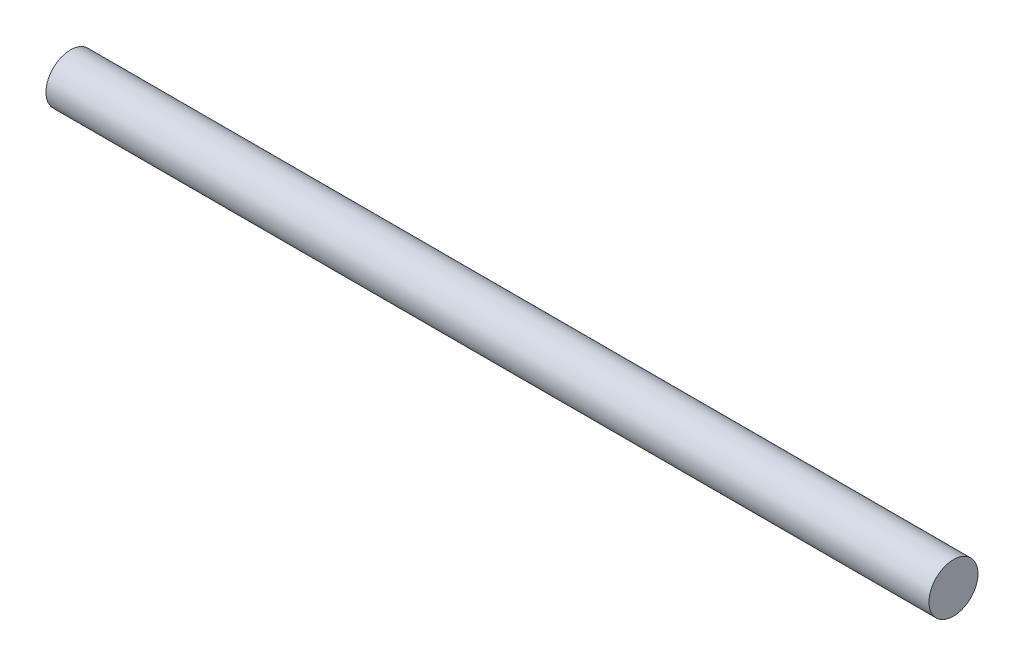
ISO-10303-21;
HEADER;
FILE_DESCRIPTION(('STEP AP214'),'2;1');
FILE_NAME('part.step','',(''),(''),'','','');
FILE_SCHEMA(('AUTOMOTIVE_DESIGN { 1 0 10303 214 1 1 1 1 }'));
ENDSEC;
DATA;
#1=APPLICATION_CONTEXT('core data for automotive mechanical design processes');
#2=APPLICATION_PROTOCOL_DEFINITION('international standard','automotive_design',2000,#1);
#3=PRODUCT_CONTEXT('',#1,'mechanical');
#4=PRODUCT('Part','Part','',(#3));
#5=PRODUCT_RELATED_PRODUCT_CATEGORY('part','',(#4));
#6=PRODUCT_DEFINITION_FORMATION('','',#4);
#7=PRODUCT_DEFINITION_CONTEXT('part definition',#1,'design');
#8=PRODUCT_DEFINITION('design','',#6,#7);
#9=PRODUCT_DEFINITION_SHAPE('','',#8);
#10=(LENGTH_UNIT() NAMED_UNIT(*) SI_UNIT(.MILLI.,.METRE.));
#11=(NAMED_UNIT(*) PLANE_ANGLE_UNIT() SI_UNIT($,.RADIAN.));
#12=(NAMED_UNIT(*) SI_UNIT($,.STERADIAN.) SOLID_ANGLE_UNIT());
#13=UNCERTAINTY_MEASURE_WITH_UNIT(LENGTH_MEASURE(1.E-05),#10,'distance_accuracy_value','');
#14=(GEOMETRIC_REPRESENTATION_CONTEXT(3) GLOBAL_UNCERTAINTY_ASSIGNED_CONTEXT((#13)) GLOBAL_UNIT_ASSIGNED_CONTEXT((#10,
#11,#12)) REPRESENTATION_CONTEXT('',''));
#15=CARTESIAN_POINT('',(0.,0.,0.));
#16=DIRECTION('',(0.,0.,1.));
#17=DIRECTION('',(1.,0.,0.));
#18=AXIS2_PLACEMENT_3D('',#15,#16,#17);
#19=CARTESIAN_POINT('',(-90.,0.,0.));
#20=DIRECTION('',(1.,0.,0.));
#21=DIRECTION('',(0.,0.,-1.));
#22=AXIS2_PLACEMENT_3D('',#19,#20,#21);
#23=CYLINDRICAL_SURFACE('',#22,2.5);
#24=CARTESIAN_POINT('',(-90.,0.,0.));
#25=DIRECTION('',(1.,0.,0.));
#26=DIRECTION('',(0.,0.,-1.));
#27=AXIS2_PLACEMENT_3D('',#24,#25,#26);
#28=CIRCLE('',#27,2.5);
#29=CARTESIAN_POINT('',(-90.,0.,-2.5));
#30=VERTEX_POINT('',#29);
#31=EDGE_CURVE('E10',#30,#30,#28,.T.);
#32=CARTESIAN_POINT('',(0.,0.,0.));
#33=DIRECTION('',(1.,0.,0.));
#34=DIRECTION('',(0.,0.,-1.));
#35=AXIS2_PLACEMENT_3D('',#32,#33,#34);
#36=CIRCLE('',#35,2.5);
#37=CARTESIAN_POINT('',(0.,0.,-2.5));
#38=VERTEX_POINT('',#37);
#39=EDGE_CURVE('E34',#38,#38,#36,.T.);
#40=CARTESIAN_POINT('',(-90.,0.,-2.5));
#41=CARTESIAN_POINT('',(-89.0625,0.,-2.5));
#42=CARTESIAN_POINT('',(-88.125,0.,-2.5));
#43=CARTESIAN_POINT('',(-86.25,0.,-2.5));
#44=CARTESIAN_POINT('',(-85.3125,0.,-2.5));
#45=CARTESIAN_POINT('',(-83.4375,0.,-2.5));
#46=CARTESIAN_POINT('',(-82.5,0.,-2.5));
#47=CARTESIAN_POINT('',(-80.625,0.,-2.5));
#48=CARTESIAN_POINT('',(-79.6875,0.,-2.5));
#49=CARTESIAN_POINT('',(-77.8125,0.,-2.5));
#50=CARTESIAN_POINT('',(-76.875,0.,-2.5));
#51=CARTESIAN_POINT('',(-75.,0.,-2.5));
#52=CARTESIAN_POINT('',(-74.0625,0.,-2.5));
#53=CARTESIAN_POINT('',(-72.1875,0.,-2.5));
#54=CARTESIAN_POINT('',(-71.25,0.,-2.5));
#55=CARTESIAN_POINT('',(-69.375,0.,-2.5));
#56=CARTESIAN_POINT('',(-68.4375,0.,-2.5));
#57=CARTESIAN_POINT('',(-66.5625,0.,-2.5));
#58=CARTESIAN_POINT('',(-65.625,0.,-2.5));
#59=CARTESIAN_POINT('',(-63.75,0.,-2.5));
#60=CARTESIAN_POINT('',(-62.8125,0.,-2.5));
#61=CARTESIAN_POINT('',(-60.9375,0.,-2.5));
#62=CARTESIAN_POINT('',(-60.,0.,-2.5));
#63=CARTESIAN_POINT('',(-58.125,0.,-2.5));
#64=CARTESIAN_POINT('',(-57.1875,0.,-2.5));
#65=CARTESIAN_POINT('',(-55.3125,0.,-2.5));
#66=CARTESIAN_POINT('',(-54.375,0.,-2.5));
#67=CARTESIAN_POINT('',(-52.5,0.,-2.5));
#68=CARTESIAN_POINT('',(-51.5625,0.,-2.5));
#69=CARTESIAN_POINT('',(-49.6875,0.,-2.5));
#70=CARTESIAN_POINT('',(-48.75,0.,-2.5));
#71=CARTESIAN_POINT('',(-46.875,0.,-2.5));
#72=CARTESIAN_POINT('',(-45.9375,0.,-2.5));
#73=CARTESIAN_POINT('',(-44.0625,0.,-2.5));
#74=CARTESIAN_POINT('',(-43.125,0.,-2.5));
#75=CARTESIAN_POINT('',(-41.25,0.,-2.5));
#76=CARTESIAN_POINT('',(-40.3125,0.,-2.5));
#77=CARTESIAN_POINT('',(-38.4375,0.,-2.5));
#78=CARTESIAN_POINT('',(-37.5,0.,-2.5));
#79=CARTESIAN_POINT('',(-35.625,0.,-2.5));
#80=CARTESIAN_POINT('',(-34.6875,0.,-2.5));
#81=CARTESIAN_POINT('',(-32.8125,0.,-2.5));
#82=CARTESIAN_POINT('',(-31.875,0.,-2.5));
#83=CARTESIAN_POINT('',(-30.,0.,-2.5));
#84=CARTESIAN_POINT('',(-29.0625,0.,-2.5));
#85=CARTESIAN_POINT('',(-27.1875,0.,-2.5));
#86=CARTESIAN_POINT('',(-26.25,0.,-2.5));
#87=CARTESIAN_POINT('',(-24.375,0.,-2.5));
#88=CARTESIAN_POINT('',(-23.4375,0.,-2.5));
#89=CARTESIAN_POINT('',(-21.5625,0.,-2.5));
#90=CARTESIAN_POINT('',(-20.625,0.,-2.5));
#91=CARTESIAN_POINT('',(-18.75,0.,-2.5));
#92=CARTESIAN_POINT('',(-17.8125,0.,-2.5));
#93=CARTESIAN_POINT('',(-15.9375,0.,-2.5));
#94=CARTESIAN_POINT('',(-15.,0.,-2.5));
#95=CARTESIAN_POINT('',(-13.125,0.,-2.5));
#96=CARTESIAN_POINT('',(-12.1875,0.,-2.5));
#97=CARTESIAN_POINT('',(-10.3125,0.,-2.5));
#98=CARTESIAN_POINT('',(-9.37500000000001,0.,-2.5));
#99=CARTESIAN_POINT('',(-7.50000000000002,0.,-2.5));
#100=CARTESIAN_POINT('',(-6.56250000000002,0.,-2.5));
#101=CARTESIAN_POINT('',(-4.68750000000002,0.,-2.5));
#102=CARTESIAN_POINT('',(-3.75000000000001,0.,-2.5));
#103=CARTESIAN_POINT('',(-1.87500000000001,0.,-2.5));
#104=CARTESIAN_POINT('',(-0.937500000000014,0.,-2.5));
#105=CARTESIAN_POINT('',(0.,0.,-2.5));
#106=B_SPLINE_CURVE_WITH_KNOTS('',3,(#40,#41,#42,#43,#44,#45,#46,#47,#48,#49,#50,#51,#52,#53,
#54,#55,#56,#57,#58,#59,#60,#61,#62,#63,#64,#65,#66,#67,#68,#69,#70,#71,#72,#73,#74,#75,#76,#77,
#78,#79,#80,#81,#82,#83,#84,#85,#86,#87,#88,#89,#90,#91,#92,#93,#94,#95,#96,#97,#98,#99,#100,
#101,#102,#103,#104,#105),.UNSPECIFIED.,.F.,.F.,(4,2,2,2,2,2,2,2,2,2,2,2,2,2,2,2,2,2,2,2,2,2,2,
2,2,2,2,2,2,2,2,2,4),(0.,2.8125,5.62499999999999,8.43749999999999,11.25,14.0625,16.875,19.6875,
22.5,25.3125,28.125,30.9375,33.75,36.5625,39.375,42.1875,45.,47.8125,50.625,53.4375,56.25,
59.0625,61.875,64.6875,67.5,70.3125,73.125,75.9375,78.75,81.5625,84.375,87.1875,90.),.UNSPECIFIED.);
#107=EDGE_CURVE('BSEAM31',#30,#38,#106,.T.);
#108=ORIENTED_EDGE('',*,*,#31,.T.);
#109=ORIENTED_EDGE('',*,*,#39,.F.);
#110=ORIENTED_EDGE('',*,*,#107,.T.);
#111=ORIENTED_EDGE('',*,*,#107,.F.);
#112=EDGE_LOOP('',(#108,#110,#109,#111));
#113=FACE_BOUND('',#112,.T.);
#114=ADVANCED_FACE('F31',(#113),#23,.T.);
#115=CARTESIAN_POINT('',(-90.,0.,0.));
#116=DIRECTION('',(1.,0.,0.));
#117=DIRECTION('',(0.,0.,-1.));
#118=AXIS2_PLACEMENT_3D('',#115,#116,#117);
#119=PLANE('',#118);
#120=ORIENTED_EDGE('',*,*,#31,.F.);
#121=EDGE_LOOP('',(#120));
#122=FACE_BOUND('',#121,.T.);
#123=ADVANCED_FACE('F46',(#122),#119,.F.);
#124=CARTESIAN_POINT('',(0.,0.,0.));
#125=DIRECTION('',(1.,0.,0.));
#126=DIRECTION('',(0.,0.,-1.));
#127=AXIS2_PLACEMENT_3D('',#124,#125,#126);
#128=PLANE('',#127);
#129=ORIENTED_EDGE('',*,*,#39,.T.);
#130=EDGE_LOOP('',(#129));
#131=FACE_BOUND('',#130,.T.);
#132=ADVANCED_FACE('F43',(#131),#128,.T.);
#133=CLOSED_SHELL('',(#114,#123,#132));
#134=MANIFOLD_SOLID_BREP('B2',#133);
#135=ADVANCED_BREP_SHAPE_REPRESENTATION('',(#18,#134),#14);
#136=SHAPE_DEFINITION_REPRESENTATION(#9,#135);
ENDSEC;
END-ISO-10303-21;
